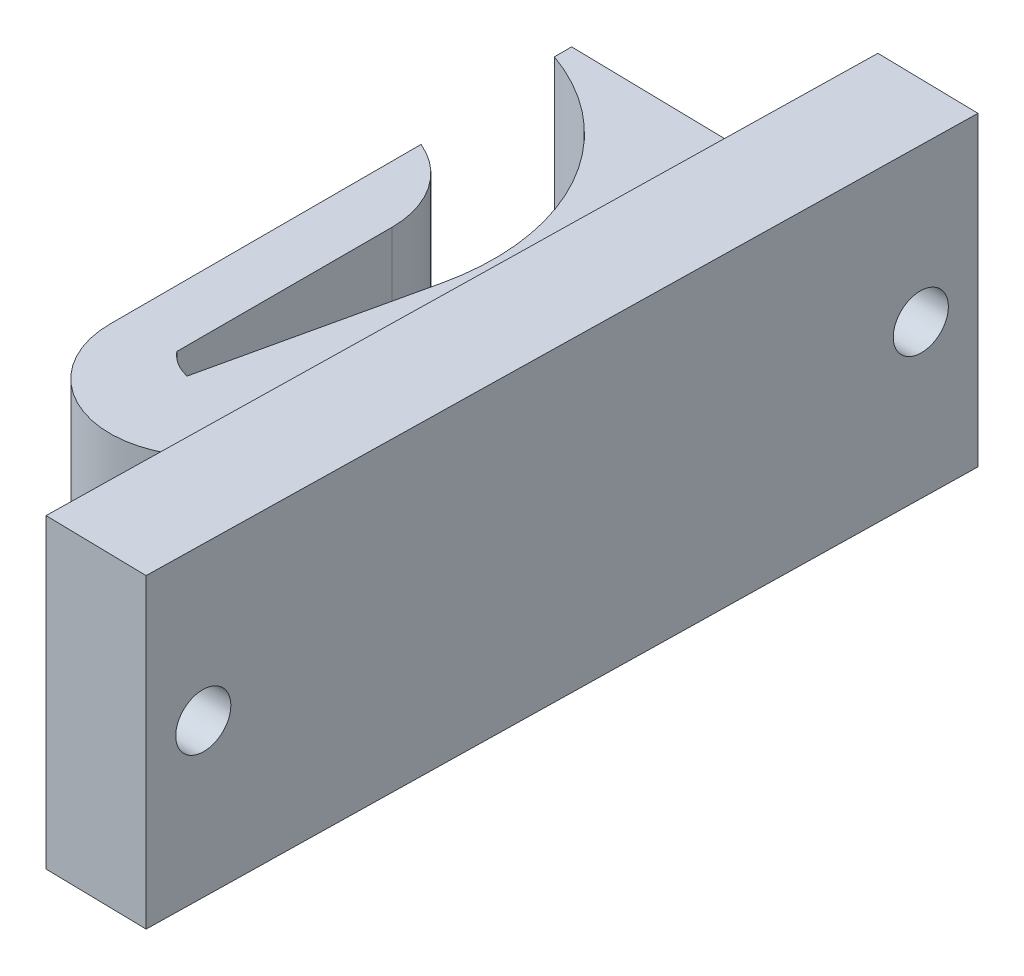
ISO-10303-21;
HEADER;
FILE_DESCRIPTION(('STEP AP214'),'2;1');
FILE_NAME('part.step','',(''),(''),'','','');
FILE_SCHEMA(('AUTOMOTIVE_DESIGN { 1 0 10303 214 1 1 1 1 }'));
ENDSEC;
DATA;
#1=APPLICATION_CONTEXT('core data for automotive mechanical design processes');
#2=APPLICATION_PROTOCOL_DEFINITION('international standard','automotive_design',2000,#1);
#3=PRODUCT_CONTEXT('',#1,'mechanical');
#4=PRODUCT('Part','Part','',(#3));
#5=PRODUCT_RELATED_PRODUCT_CATEGORY('part','',(#4));
#6=PRODUCT_DEFINITION_FORMATION('','',#4);
#7=PRODUCT_DEFINITION_CONTEXT('part definition',#1,'design');
#8=PRODUCT_DEFINITION('design','',#6,#7);
#9=PRODUCT_DEFINITION_SHAPE('','',#8);
#10=(LENGTH_UNIT() NAMED_UNIT(*) SI_UNIT(.MILLI.,.METRE.));
#11=(NAMED_UNIT(*) PLANE_ANGLE_UNIT() SI_UNIT($,.RADIAN.));
#12=(NAMED_UNIT(*) SI_UNIT($,.STERADIAN.) SOLID_ANGLE_UNIT());
#13=UNCERTAINTY_MEASURE_WITH_UNIT(LENGTH_MEASURE(1.E-05),#10,'distance_accuracy_value','');
#14=(GEOMETRIC_REPRESENTATION_CONTEXT(3) GLOBAL_UNCERTAINTY_ASSIGNED_CONTEXT((#13)) GLOBAL_UNIT_ASSIGNED_CONTEXT((#10,
#11,#12)) REPRESENTATION_CONTEXT('',''));
#15=CARTESIAN_POINT('',(0.,0.,0.));
#16=DIRECTION('',(0.,0.,1.));
#17=DIRECTION('',(1.,0.,0.));
#18=AXIS2_PLACEMENT_3D('',#15,#16,#17);
#19=CARTESIAN_POINT('',(19.4578777462422,25.,30.5814100525998));
#20=DIRECTION('',(0.,-1.,0.));
#21=DIRECTION('',(0.,0.,-1.));
#22=AXIS2_PLACEMENT_3D('',#19,#20,#21);
#23=CYLINDRICAL_SURFACE('',#22,4.71068136707812);
#24=CARTESIAN_POINT('',(19.4578777462422,0.,30.5814100525998));
#25=DIRECTION('',(0.,-1.,0.));
#26=DIRECTION('',(0.,0.,-1.));
#27=AXIS2_PLACEMENT_3D('',#24,#25,#26);
#28=CIRCLE('',#27,4.71068136707812);
#29=CARTESIAN_POINT('',(18.4245412724948,0.,35.177357688742));
#30=VERTEX_POINT('',#29);
#31=CARTESIAN_POINT('',(15.8330571777441,0.,33.589930417884));
#32=VERTEX_POINT('',#31);
#33=EDGE_CURVE('E152',#30,#32,#28,.T.);
#34=ORIENTED_EDGE('',*,*,#33,.T.);
#35=DIRECTION('',(0.,-1.,0.));
#36=VECTOR('',#35,1.);
#37=CARTESIAN_POINT('',(15.8330571777441,25.,33.589930417884));
#38=LINE('',#37,#36);
#39=CARTESIAN_POINT('',(15.8330571777441,25.,33.589930417884));
#40=VERTEX_POINT('',#39);
#41=EDGE_CURVE('E11',#40,#32,#38,.T.);
#42=ORIENTED_EDGE('',*,*,#41,.F.);
#43=CARTESIAN_POINT('',(19.4578777462422,25.,30.5814100525998));
#44=DIRECTION('',(0.,-1.,0.));
#45=DIRECTION('',(0.,0.,-1.));
#46=AXIS2_PLACEMENT_3D('',#43,#44,#45);
#47=CIRCLE('',#46,4.71068136707812);
#48=CARTESIAN_POINT('',(18.4245412724948,25.,35.177357688742));
#49=VERTEX_POINT('',#48);
#50=EDGE_CURVE('E183',#49,#40,#47,.T.);
#51=ORIENTED_EDGE('',*,*,#50,.F.);
#52=DIRECTION('',(0.,-1.,0.));
#53=VECTOR('',#52,1.);
#54=CARTESIAN_POINT('',(18.4245412724948,25.,35.177357688742));
#55=LINE('',#54,#53);
#56=EDGE_CURVE('E148',#49,#30,#55,.T.);
#57=ORIENTED_EDGE('',*,*,#56,.T.);
#58=EDGE_LOOP('',(#34,#42,#51,#57));
#59=FACE_BOUND('',#58,.T.);
#60=ADVANCED_FACE('F39',(#59),#23,.F.);
#61=CARTESIAN_POINT('',(15.8330571777441,25.,33.589930417884));
#62=DIRECTION('',(-1.,0.,0.));
#63=DIRECTION('',(0.,0.,1.));
#64=AXIS2_PLACEMENT_3D('',#61,#62,#63);
#65=PLANE('',#64);
#66=DIRECTION('',(0.,0.,-1.));
#67=VECTOR('',#66,1.);
#68=CARTESIAN_POINT('',(15.8330571777441,0.,33.589930417884));
#69=LINE('',#68,#67);
#70=CARTESIAN_POINT('',(15.8330571777441,0.,12.4880063048794));
#71=VERTEX_POINT('',#70);
#72=EDGE_CURVE('E156',#32,#71,#69,.T.);
#73=ORIENTED_EDGE('',*,*,#72,.T.);
#74=DIRECTION('',(0.,-1.,0.));
#75=VECTOR('',#74,1.);
#76=CARTESIAN_POINT('',(15.8330571777441,25.,12.4880063048794));
#77=LINE('',#76,#75);
#78=CARTESIAN_POINT('',(15.8330571777441,25.,12.4880063048794));
#79=VERTEX_POINT('',#78);
#80=EDGE_CURVE('E48',#79,#71,#77,.T.);
#81=ORIENTED_EDGE('',*,*,#80,.F.);
#82=DIRECTION('',(0.,0.,-1.));
#83=VECTOR('',#82,1.);
#84=CARTESIAN_POINT('',(15.8330571777441,25.,33.589930417884));
#85=LINE('',#84,#83);
#86=EDGE_CURVE('E103',#40,#79,#85,.T.);
#87=ORIENTED_EDGE('',*,*,#86,.F.);
#88=ORIENTED_EDGE('',*,*,#41,.T.);
#89=EDGE_LOOP('',(#73,#81,#87,#88));
#90=FACE_BOUND('',#89,.T.);
#91=ADVANCED_FACE('F330',(#90),#65,.F.);
#92=CARTESIAN_POINT('',(6.67701045397746,25.,12.4880063048794));
#93=DIRECTION('',(0.,-1.,0.));
#94=DIRECTION('',(0.,0.,-1.));
#95=AXIS2_PLACEMENT_3D('',#92,#93,#94);
#96=CYLINDRICAL_SURFACE('',#95,9.15604672376662);
#97=CARTESIAN_POINT('',(6.67701045397746,0.,12.4880063048794));
#98=DIRECTION('',(0.,1.,0.));
#99=DIRECTION('',(0.,0.,1.));
#100=AXIS2_PLACEMENT_3D('',#97,#98,#99);
#101=CIRCLE('',#100,9.15604672376662);
#102=CARTESIAN_POINT('',(10.2278698948714,0.,4.04854015832654));
#103=VERTEX_POINT('',#102);
#104=EDGE_CURVE('E160',#71,#103,#101,.T.);
#105=ORIENTED_EDGE('',*,*,#104,.T.);
#106=DIRECTION('',(0.,-1.,0.));
#107=VECTOR('',#106,1.);
#108=CARTESIAN_POINT('',(10.2278698948714,25.,4.04854015832654));
#109=LINE('',#108,#107);
#110=CARTESIAN_POINT('',(10.2278698948714,25.,4.04854015832654));
#111=VERTEX_POINT('',#110);
#112=EDGE_CURVE('E201',#111,#103,#109,.T.);
#113=ORIENTED_EDGE('',*,*,#112,.F.);
#114=CARTESIAN_POINT('',(6.67701045397746,25.,12.4880063048794));
#115=DIRECTION('',(0.,1.,0.));
#116=DIRECTION('',(0.,0.,1.));
#117=AXIS2_PLACEMENT_3D('',#114,#115,#116);
#118=CIRCLE('',#117,9.15604672376662);
#119=EDGE_CURVE('E211',#79,#111,#118,.T.);
#120=ORIENTED_EDGE('',*,*,#119,.F.);
#121=ORIENTED_EDGE('',*,*,#80,.T.);
#122=EDGE_LOOP('',(#105,#113,#120,#121));
#123=FACE_BOUND('',#122,.T.);
#124=ADVANCED_FACE('F209',(#123),#96,.T.);
#125=CARTESIAN_POINT('',(10.2278698948714,25.,4.04854015832654));
#126=DIRECTION('',(1.,0.,0.));
#127=DIRECTION('',(0.,0.,-1.));
#128=AXIS2_PLACEMENT_3D('',#125,#126,#127);
#129=PLANE('',#128);
#130=DIRECTION('',(0.,0.,1.));
#131=VECTOR('',#130,1.);
#132=CARTESIAN_POINT('',(10.2278698948714,0.,4.04854015832654));
#133=LINE('',#132,#131);
#134=CARTESIAN_POINT('',(10.2278698948714,0.,34.5268915551637));
#135=VERTEX_POINT('',#134);
#136=EDGE_CURVE('E163',#103,#135,#133,.T.);
#137=ORIENTED_EDGE('',*,*,#136,.T.);
#138=DIRECTION('',(0.,-1.,0.));
#139=VECTOR('',#138,1.);
#140=CARTESIAN_POINT('',(10.2278698948714,25.,34.5268915551637));
#141=LINE('',#140,#139);
#142=CARTESIAN_POINT('',(10.2278698948714,25.,34.5268915551637));
#143=VERTEX_POINT('',#142);
#144=EDGE_CURVE('E197',#143,#135,#141,.T.);
#145=ORIENTED_EDGE('',*,*,#144,.F.);
#146=DIRECTION('',(0.,0.,1.));
#147=VECTOR('',#146,1.);
#148=CARTESIAN_POINT('',(10.2278698948714,25.,4.04854015832654));
#149=LINE('',#148,#147);
#150=EDGE_CURVE('E230',#111,#143,#149,.T.);
#151=ORIENTED_EDGE('',*,*,#150,.F.);
#152=ORIENTED_EDGE('',*,*,#112,.T.);
#153=EDGE_LOOP('',(#137,#145,#151,#152));
#154=FACE_BOUND('',#153,.T.);
#155=ADVANCED_FACE('F220',(#154),#129,.F.);
#156=CARTESIAN_POINT('',(19.5243776115971,25.,34.5268915551637));
#157=DIRECTION('',(0.,-1.,0.));
#158=DIRECTION('',(0.,0.,-1.));
#159=AXIS2_PLACEMENT_3D('',#156,#157,#158);
#160=CYLINDRICAL_SURFACE('',#159,9.29650771672567);
#161=CARTESIAN_POINT('',(19.5243776115971,0.,34.5268915551637));
#162=DIRECTION('',(0.,1.,0.));
#163=DIRECTION('',(0.,0.,1.));
#164=AXIS2_PLACEMENT_3D('',#161,#162,#163);
#165=CIRCLE('',#164,9.29650771672567);
#166=CARTESIAN_POINT('',(25.9329867470875,0.,41.2614876585429));
#167=VERTEX_POINT('',#166);
#168=EDGE_CURVE('E166',#135,#167,#165,.T.);
#169=ORIENTED_EDGE('',*,*,#168,.T.);
#170=DIRECTION('',(0.,-1.,0.));
#171=VECTOR('',#170,1.);
#172=CARTESIAN_POINT('',(25.9329867470875,25.,41.2614876585429));
#173=LINE('',#172,#171);
#174=CARTESIAN_POINT('',(25.9329867470875,25.,41.2614876585429));
#175=VERTEX_POINT('',#174);
#176=EDGE_CURVE('E193',#175,#167,#173,.T.);
#177=ORIENTED_EDGE('',*,*,#176,.F.);
#178=CARTESIAN_POINT('',(19.5243776115971,25.,34.5268915551637));
#179=DIRECTION('',(0.,1.,0.));
#180=DIRECTION('',(0.,0.,1.));
#181=AXIS2_PLACEMENT_3D('',#178,#179,#180);
#182=CIRCLE('',#181,9.29650771672567);
#183=EDGE_CURVE('E226',#143,#175,#182,.T.);
#184=ORIENTED_EDGE('',*,*,#183,.F.);
#185=ORIENTED_EDGE('',*,*,#144,.T.);
#186=EDGE_LOOP('',(#169,#177,#184,#185));
#187=FACE_BOUND('',#186,.T.);
#188=ADVANCED_FACE('F224',(#187),#160,.T.);
#189=CARTESIAN_POINT('',(26.9375325014628,25.,-11.2670614667355));
#190=DIRECTION('',(-0.0191203094367821,0.,0.999817190173805));
#191=DIRECTION('',(0.999817190173805,0.,0.0191203094367821));
#192=AXIS2_PLACEMENT_3D('',#189,#190,#191);
#193=PLANE('',#192);
#194=DIRECTION('',(-0.999817190173805,0.,-0.0191203094367821));
#195=VECTOR('',#194,1.);
#196=CARTESIAN_POINT('',(26.9375325014628,0.,-11.2670614667355));
#197=LINE('',#196,#195);
#198=CARTESIAN_POINT('',(26.9375325014628,0.,-11.2670614667355));
#199=VERTEX_POINT('',#198);
#200=CARTESIAN_POINT('',(9.32651249786059,0.,-11.603851187172));
#201=VERTEX_POINT('',#200);
#202=EDGE_CURVE('E174',#199,#201,#197,.T.);
#203=ORIENTED_EDGE('',*,*,#202,.T.);
#204=DIRECTION('',(0.,-1.,0.));
#205=VECTOR('',#204,1.);
#206=CARTESIAN_POINT('',(9.32651249786059,25.,-11.603851187172));
#207=LINE('',#206,#205);
#208=CARTESIAN_POINT('',(9.32651249786059,25.,-11.603851187172));
#209=VERTEX_POINT('',#208);
#210=EDGE_CURVE('E141',#209,#201,#207,.T.);
#211=ORIENTED_EDGE('',*,*,#210,.F.);
#212=DIRECTION('',(-0.999817190173805,0.,-0.0191203094367821));
#213=VECTOR('',#212,1.);
#214=CARTESIAN_POINT('',(26.9375325014628,25.,-11.2670614667355));
#215=LINE('',#214,#213);
#216=CARTESIAN_POINT('',(26.9375325014628,25.,-11.2670614667355));
#217=VERTEX_POINT('',#216);
#218=EDGE_CURVE('E130',#217,#209,#215,.T.);
#219=ORIENTED_EDGE('',*,*,#218,.F.);
#220=DIRECTION('',(0.,-1.,0.));
#221=VECTOR('',#220,1.);
#222=CARTESIAN_POINT('',(26.9375325014628,25.,-11.2670614667355));
#223=LINE('',#222,#221);
#224=EDGE_CURVE('E190',#217,#199,#223,.T.);
#225=ORIENTED_EDGE('',*,*,#224,.T.);
#226=EDGE_LOOP('',(#203,#211,#219,#225));
#227=FACE_BOUND('',#226,.T.);
#228=ADVANCED_FACE('F407',(#227),#193,.F.);
#229=CARTESIAN_POINT('',(9.32651249786059,25.,-11.603851187172));
#230=DIRECTION('',(1.,0.,0.));
#231=DIRECTION('',(0.,0.,-1.));
#232=AXIS2_PLACEMENT_3D('',#229,#230,#231);
#233=PLANE('',#232);
#234=DIRECTION('',(0.,0.,1.));
#235=VECTOR('',#234,1.);
#236=CARTESIAN_POINT('',(9.32651249786059,0.,-11.603851187172));
#237=LINE('',#236,#235);
#238=CARTESIAN_POINT('',(9.32651249786059,0.,-9.914096331229));
#239=VERTEX_POINT('',#238);
#240=EDGE_CURVE('E139',#201,#239,#237,.T.);
#241=ORIENTED_EDGE('',*,*,#240,.T.);
#242=DIRECTION('',(0.,-1.,0.));
#243=VECTOR('',#242,1.);
#244=CARTESIAN_POINT('',(9.32651249786059,25.,-9.914096331229));
#245=LINE('',#244,#243);
#246=CARTESIAN_POINT('',(9.32651249786059,25.,-9.914096331229));
#247=VERTEX_POINT('',#246);
#248=EDGE_CURVE('E136',#247,#239,#245,.T.);
#249=ORIENTED_EDGE('',*,*,#248,.F.);
#250=DIRECTION('',(0.,0.,1.));
#251=VECTOR('',#250,1.);
#252=CARTESIAN_POINT('',(9.32651249786059,25.,-11.603851187172));
#253=LINE('',#252,#251);
#254=EDGE_CURVE('E124',#209,#247,#253,.T.);
#255=ORIENTED_EDGE('',*,*,#254,.F.);
#256=ORIENTED_EDGE('',*,*,#210,.T.);
#257=EDGE_LOOP('',(#241,#249,#255,#256));
#258=FACE_BOUND('',#257,.T.);
#259=ADVANCED_FACE('F137',(#258),#233,.F.);
#260=CARTESIAN_POINT('',(2.26541768259489,25.,10.1372936714378));
#261=DIRECTION('',(0.,-1.,0.));
#262=DIRECTION('',(0.,0.,-1.));
#263=AXIS2_PLACEMENT_3D('',#260,#261,#262);
#264=CYLINDRICAL_SURFACE('',#263,21.2583466203093);
#265=CARTESIAN_POINT('',(2.26541768259489,0.,10.1372936714378));
#266=DIRECTION('',(0.,-1.,0.));
#267=DIRECTION('',(0.,0.,1.));
#268=AXIS2_PLACEMENT_3D('',#265,#266,#267);
#269=CIRCLE('',#268,21.2583466203093);
#270=CARTESIAN_POINT('',(23.0059943177965,0.,14.8005309448931));
#271=VERTEX_POINT('',#270);
#272=EDGE_CURVE('E89',#239,#271,#269,.T.);
#273=ORIENTED_EDGE('',*,*,#272,.T.);
#274=DIRECTION('',(0.,-1.,0.));
#275=VECTOR('',#274,1.);
#276=CARTESIAN_POINT('',(23.0059943177965,25.,14.8005309448931));
#277=LINE('',#276,#275);
#278=CARTESIAN_POINT('',(23.0059943177965,25.,14.8005309448931));
#279=VERTEX_POINT('',#278);
#280=EDGE_CURVE('E142',#279,#271,#277,.T.);
#281=ORIENTED_EDGE('',*,*,#280,.F.);
#282=CARTESIAN_POINT('',(2.26541768259489,25.,10.1372936714378));
#283=DIRECTION('',(0.,-1.,0.));
#284=DIRECTION('',(0.,0.,1.));
#285=AXIS2_PLACEMENT_3D('',#282,#283,#284);
#286=CIRCLE('',#285,21.2583466203093);
#287=EDGE_CURVE('E128',#247,#279,#286,.T.);
#288=ORIENTED_EDGE('',*,*,#287,.F.);
#289=ORIENTED_EDGE('',*,*,#248,.T.);
#290=EDGE_LOOP('',(#273,#281,#288,#289));
#291=FACE_BOUND('',#290,.T.);
#292=ADVANCED_FACE('F144',(#291),#264,.F.);
#293=CARTESIAN_POINT('',(18.4245412724948,25.,35.177357688742));
#294=DIRECTION('',(0.975643920274919,0.,0.219360299121303));
#295=DIRECTION('',(0.219360299121303,0.,-0.975643920274919));
#296=AXIS2_PLACEMENT_3D('',#293,#294,#295);
#297=PLANE('',#296);
#298=DIRECTION('',(-0.219360299121303,0.,0.975643920274919));
#299=VECTOR('',#298,1.);
#300=CARTESIAN_POINT('',(18.4245412724948,0.,35.177357688742));
#301=LINE('',#300,#299);
#302=EDGE_CURVE('E95',#271,#30,#301,.T.);
#303=ORIENTED_EDGE('',*,*,#302,.T.);
#304=ORIENTED_EDGE('',*,*,#56,.F.);
#305=DIRECTION('',(-0.219360299121303,0.,0.975643920274919));
#306=VECTOR('',#305,1.);
#307=CARTESIAN_POINT('',(18.4245412724948,25.,35.177357688742));
#308=LINE('',#307,#306);
#309=EDGE_CURVE('E56',#279,#49,#308,.T.);
#310=ORIENTED_EDGE('',*,*,#309,.F.);
#311=ORIENTED_EDGE('',*,*,#280,.T.);
#312=EDGE_LOOP('',(#303,#304,#310,#311));
#313=FACE_BOUND('',#312,.T.);
#314=ADVANCED_FACE('F398',(#313),#297,.F.);
#315=CARTESIAN_POINT('',(19.4578777462422,25.,30.5814100525998));
#316=DIRECTION('',(0.,-1.,0.));
#317=DIRECTION('',(0.,0.,-1.));
#318=AXIS2_PLACEMENT_3D('',#315,#316,#317);
#319=PLANE('',#318);
#320=ORIENTED_EDGE('',*,*,#50,.T.);
#321=ORIENTED_EDGE('',*,*,#86,.T.);
#322=ORIENTED_EDGE('',*,*,#119,.T.);
#323=ORIENTED_EDGE('',*,*,#150,.T.);
#324=ORIENTED_EDGE('',*,*,#183,.T.);
#325=DIRECTION('',(0.0191203094367821,0.,-0.999817190173805));
#326=VECTOR('',#325,1.);
#327=CARTESIAN_POINT('',(25.9329867470875,25.,41.2614876585429));
#328=LINE('',#327,#326);
#329=EDGE_CURVE('E229',#175,#217,#328,.T.);
#330=ORIENTED_EDGE('',*,*,#329,.T.);
#331=ORIENTED_EDGE('',*,*,#218,.T.);
#332=ORIENTED_EDGE('',*,*,#254,.T.);
#333=ORIENTED_EDGE('',*,*,#287,.T.);
#334=ORIENTED_EDGE('',*,*,#309,.T.);
#335=EDGE_LOOP('',(#320,#321,#322,#323,#324,#330,#331,#332,#333,#334));
#336=FACE_BOUND('',#335,.T.);
#337=ADVANCED_FACE('F126',(#336),#319,.F.);
#338=CARTESIAN_POINT('',(19.4578777462422,0.,30.5814100525998));
#339=DIRECTION('',(0.,-1.,0.));
#340=DIRECTION('',(0.,0.,-1.));
#341=AXIS2_PLACEMENT_3D('',#338,#339,#340);
#342=PLANE('',#341);
#343=ORIENTED_EDGE('',*,*,#33,.F.);
#344=ORIENTED_EDGE('',*,*,#302,.F.);
#345=ORIENTED_EDGE('',*,*,#272,.F.);
#346=ORIENTED_EDGE('',*,*,#240,.F.);
#347=ORIENTED_EDGE('',*,*,#202,.F.);
#348=DIRECTION('',(0.0191203094367821,0.,-0.999817190173805));
#349=VECTOR('',#348,1.);
#350=CARTESIAN_POINT('',(25.9329867470875,0.,41.2614876585429));
#351=LINE('',#350,#349);
#352=EDGE_CURVE('E170',#167,#199,#351,.T.);
#353=ORIENTED_EDGE('',*,*,#352,.F.);
#354=ORIENTED_EDGE('',*,*,#168,.F.);
#355=ORIENTED_EDGE('',*,*,#136,.F.);
#356=ORIENTED_EDGE('',*,*,#104,.F.);
#357=ORIENTED_EDGE('',*,*,#72,.F.);
#358=EDGE_LOOP('',(#343,#344,#345,#346,#347,#353,#354,#355,#356,#357));
#359=FACE_BOUND('',#358,.T.);
#360=ADVANCED_FACE('F215',(#359),#342,.T.);
#361=CARTESIAN_POINT('',(26.7122941914095,0.,0.510840717408869));
#362=DIRECTION('',(0.999817190173805,0.,0.0191203094367821));
#363=DIRECTION('',(0.0191203094367821,0.,-0.999817190173805));
#364=AXIS2_PLACEMENT_3D('',#361,#362,#363);
#365=PLANE('',#364);
#366=DIRECTION('',(0.,1.,0.));
#367=VECTOR('',#366,1.);
#368=CARTESIAN_POINT('',(27.1765363694225,27.3,-23.764776343908));
#369=LINE('',#368,#367);
#370=CARTESIAN_POINT('',(27.1765363694225,-2.7,-23.764776343908));
#371=VERTEX_POINT('',#370);
#372=CARTESIAN_POINT('',(27.1765363694225,27.3,-23.764776343908));
#373=VERTEX_POINT('',#372);
#374=EDGE_CURVE('E273',#371,#373,#369,.T.);
#375=ORIENTED_EDGE('',*,*,#374,.F.);
#376=DIRECTION('',(0.0191203094367821,0.,-0.999817190173805));
#377=VECTOR('',#376,1.);
#378=CARTESIAN_POINT('',(25.64691161448,-2.7,56.2205988699963));
#379=LINE('',#378,#377);
#380=CARTESIAN_POINT('',(25.64691161448,-2.7,56.2205988699963));
#381=VERTEX_POINT('',#380);
#382=EDGE_CURVE('E260',#381,#371,#379,.T.);
#383=ORIENTED_EDGE('',*,*,#382,.F.);
#384=DIRECTION('',(0.,-1.,0.));
#385=VECTOR('',#384,1.);
#386=CARTESIAN_POINT('',(25.64691161448,27.3,56.2205988699963));
#387=LINE('',#386,#385);
#388=CARTESIAN_POINT('',(25.64691161448,27.3,56.2205988699963));
#389=VERTEX_POINT('',#388);
#390=EDGE_CURVE('E265',#389,#381,#387,.T.);
#391=ORIENTED_EDGE('',*,*,#390,.F.);
#392=DIRECTION('',(-0.0191203094367821,0.,0.999817190173805));
#393=VECTOR('',#392,1.);
#394=CARTESIAN_POINT('',(25.64691161448,27.3,56.2205988699963));
#395=LINE('',#394,#393);
#396=EDGE_CURVE('E269',#373,#389,#395,.T.);
#397=ORIENTED_EDGE('',*,*,#396,.F.);
#398=EDGE_LOOP('',(#375,#383,#391,#397));
#399=FACE_BOUND('',#398,.T.);
#400=CARTESIAN_POINT('',(27.0713746675202,12.3,-18.2657817979521));
#401=DIRECTION('',(0.999817190173805,0.,0.0191203094367821));
#402=DIRECTION('',(0.0191203094367821,0.,-0.999817190173805));
#403=AXIS2_PLACEMENT_3D('',#400,#401,#402);
#404=CIRCLE('',#403,2.6510569966331);
#405=CARTESIAN_POINT('',(27.1220636976304,12.3,-20.9163541553164));
#406=VERTEX_POINT('',#405);
#407=EDGE_CURVE('E292',#406,#406,#404,.T.);
#408=ORIENTED_EDGE('',*,*,#407,.T.);
#409=EDGE_LOOP('',(#408));
#410=FACE_BOUND('',#409,.T.);
#411=CARTESIAN_POINT('',(25.7520733163823,12.3,50.7216043240404));
#412=DIRECTION('',(0.999817190173805,0.,0.0191203094367821));
#413=DIRECTION('',(0.0191203094367821,0.,-0.999817190173805));
#414=AXIS2_PLACEMENT_3D('',#411,#412,#413);
#415=CIRCLE('',#414,2.6510569966331);
#416=CARTESIAN_POINT('',(25.8027623464924,12.3,48.0710319666761));
#417=VERTEX_POINT('',#416);
#418=EDGE_CURVE('E300',#417,#417,#415,.T.);
#419=ORIENTED_EDGE('',*,*,#418,.T.);
#420=EDGE_LOOP('',(#419));
#421=FACE_BOUND('',#420,.T.);
#422=ORIENTED_EDGE('',*,*,#176,.T.);
#423=ORIENTED_EDGE('',*,*,#352,.T.);
#424=ORIENTED_EDGE('',*,*,#224,.F.);
#425=ORIENTED_EDGE('',*,*,#329,.F.);
#426=EDGE_LOOP('',(#422,#423,#424,#425));
#427=FACE_BOUND('',#426,.T.);
#428=ADVANCED_FACE('F314',(#399,#410,#421,#427),#365,.F.);
#429=CARTESIAN_POINT('',(36.7104660931475,0.,0.70204381177669));
#430=DIRECTION('',(0.999817190173805,0.,0.0191203094367821));
#431=DIRECTION('',(0.0191203094367821,0.,-0.999817190173805));
#432=AXIS2_PLACEMENT_3D('',#429,#430,#431);
#433=PLANE('',#432);
#434=CARTESIAN_POINT('',(37.0695465692583,12.3,-18.0745787035843));
#435=DIRECTION('',(0.999817190173805,0.,0.0191203094367821));
#436=DIRECTION('',(0.0191203094367821,0.,-0.999817190173805));
#437=AXIS2_PLACEMENT_3D('',#434,#435,#436);
#438=CIRCLE('',#437,2.6510569966331);
#439=CARTESIAN_POINT('',(37.1202355993684,12.3,-20.7251510609486));
#440=VERTEX_POINT('',#439);
#441=EDGE_CURVE('E277',#440,#440,#438,.T.);
#442=ORIENTED_EDGE('',*,*,#441,.F.);
#443=EDGE_LOOP('',(#442));
#444=FACE_BOUND('',#443,.T.);
#445=DIRECTION('',(0.,1.,0.));
#446=VECTOR('',#445,1.);
#447=CARTESIAN_POINT('',(37.1747082711606,27.3,-23.5735732495402));
#448=LINE('',#447,#446);
#449=CARTESIAN_POINT('',(37.1747082711606,-2.7,-23.5735732495402));
#450=VERTEX_POINT('',#449);
#451=CARTESIAN_POINT('',(37.1747082711606,27.3,-23.5735732495402));
#452=VERTEX_POINT('',#451);
#453=EDGE_CURVE('E264',#450,#452,#448,.T.);
#454=ORIENTED_EDGE('',*,*,#453,.T.);
#455=DIRECTION('',(-0.0191203094367821,0.,0.999817190173805));
#456=VECTOR('',#455,1.);
#457=CARTESIAN_POINT('',(35.645083516218,27.3,56.4118019643642));
#458=LINE('',#457,#456);
#459=CARTESIAN_POINT('',(35.645083516218,27.3,56.4118019643642));
#460=VERTEX_POINT('',#459);
#461=EDGE_CURVE('E285',#452,#460,#458,.T.);
#462=ORIENTED_EDGE('',*,*,#461,.T.);
#463=DIRECTION('',(0.,-1.,0.));
#464=VECTOR('',#463,1.);
#465=CARTESIAN_POINT('',(35.645083516218,27.3,56.4118019643642));
#466=LINE('',#465,#464);
#467=CARTESIAN_POINT('',(35.645083516218,-2.7,56.4118019643642));
#468=VERTEX_POINT('',#467);
#469=EDGE_CURVE('E281',#460,#468,#466,.T.);
#470=ORIENTED_EDGE('',*,*,#469,.T.);
#471=DIRECTION('',(0.0191203094367821,0.,-0.999817190173805));
#472=VECTOR('',#471,1.);
#473=CARTESIAN_POINT('',(35.645083516218,-2.7,56.4118019643642));
#474=LINE('',#473,#472);
#475=EDGE_CURVE('E259',#468,#450,#474,.T.);
#476=ORIENTED_EDGE('',*,*,#475,.T.);
#477=EDGE_LOOP('',(#454,#462,#470,#476));
#478=FACE_BOUND('',#477,.T.);
#479=CARTESIAN_POINT('',(35.7502452181203,12.3,50.9128074184082));
#480=DIRECTION('',(0.999817190173805,0.,0.0191203094367821));
#481=DIRECTION('',(0.0191203094367821,0.,-0.999817190173805));
#482=AXIS2_PLACEMENT_3D('',#479,#480,#481);
#483=CIRCLE('',#482,2.6510569966331);
#484=CARTESIAN_POINT('',(35.8009342482305,12.3,48.2622350610439));
#485=VERTEX_POINT('',#484);
#486=EDGE_CURVE('E296',#485,#485,#483,.T.);
#487=ORIENTED_EDGE('',*,*,#486,.F.);
#488=EDGE_LOOP('',(#487));
#489=FACE_BOUND('',#488,.T.);
#490=ADVANCED_FACE('F311',(#444,#478,#489),#433,.T.);
#491=CARTESIAN_POINT('',(37.1747082711606,27.3,-23.5735732495402));
#492=DIRECTION('',(-0.0191203094367821,0.,0.999817190173805));
#493=DIRECTION('',(0.999817190173805,0.,0.0191203094367821));
#494=AXIS2_PLACEMENT_3D('',#491,#492,#493);
#495=PLANE('',#494);
#496=ORIENTED_EDGE('',*,*,#374,.T.);
#497=DIRECTION('',(-0.999817190173805,0.,-0.0191203094367821));
#498=VECTOR('',#497,1.);
#499=CARTESIAN_POINT('',(37.1747082711606,27.3,-23.5735732495402));
#500=LINE('',#499,#498);
#501=EDGE_CURVE('E157',#452,#373,#500,.T.);
#502=ORIENTED_EDGE('',*,*,#501,.F.);
#503=ORIENTED_EDGE('',*,*,#453,.F.);
#504=DIRECTION('',(-0.999817190173805,0.,-0.0191203094367821));
#505=VECTOR('',#504,1.);
#506=CARTESIAN_POINT('',(37.1747082711606,-2.7,-23.5735732495402));
#507=LINE('',#506,#505);
#508=EDGE_CURVE('E255',#450,#371,#507,.T.);
#509=ORIENTED_EDGE('',*,*,#508,.T.);
#510=EDGE_LOOP('',(#496,#502,#503,#509));
#511=FACE_BOUND('',#510,.T.);
#512=ADVANCED_FACE('F313',(#511),#495,.F.);
#513=CARTESIAN_POINT('',(35.645083516218,27.3,56.4118019643642));
#514=DIRECTION('',(0.,-1.,0.));
#515=DIRECTION('',(0.,0.,-1.));
#516=AXIS2_PLACEMENT_3D('',#513,#514,#515);
#517=PLANE('',#516);
#518=ORIENTED_EDGE('',*,*,#396,.T.);
#519=DIRECTION('',(-0.999817190173805,0.,-0.0191203094367821));
#520=VECTOR('',#519,1.);
#521=CARTESIAN_POINT('',(35.645083516218,27.3,56.4118019643642));
#522=LINE('',#521,#520);
#523=EDGE_CURVE('E247',#460,#389,#522,.T.);
#524=ORIENTED_EDGE('',*,*,#523,.F.);
#525=ORIENTED_EDGE('',*,*,#461,.F.);
#526=ORIENTED_EDGE('',*,*,#501,.T.);
#527=EDGE_LOOP('',(#518,#524,#525,#526));
#528=FACE_BOUND('',#527,.T.);
#529=ADVANCED_FACE('F321',(#528),#517,.F.);
#530=CARTESIAN_POINT('',(35.645083516218,27.3,56.4118019643642));
#531=DIRECTION('',(0.0191203094367821,0.,-0.999817190173805));
#532=DIRECTION('',(-0.999817190173805,0.,-0.0191203094367821));
#533=AXIS2_PLACEMENT_3D('',#530,#531,#532);
#534=PLANE('',#533);
#535=ORIENTED_EDGE('',*,*,#390,.T.);
#536=DIRECTION('',(-0.999817190173805,0.,-0.0191203094367821));
#537=VECTOR('',#536,1.);
#538=CARTESIAN_POINT('',(35.645083516218,-2.7,56.4118019643642));
#539=LINE('',#538,#537);
#540=EDGE_CURVE('E251',#468,#381,#539,.T.);
#541=ORIENTED_EDGE('',*,*,#540,.F.);
#542=ORIENTED_EDGE('',*,*,#469,.F.);
#543=ORIENTED_EDGE('',*,*,#523,.T.);
#544=EDGE_LOOP('',(#535,#541,#542,#543));
#545=FACE_BOUND('',#544,.T.);
#546=ADVANCED_FACE('F370',(#545),#534,.F.);
#547=CARTESIAN_POINT('',(35.645083516218,-2.7,56.4118019643642));
#548=DIRECTION('',(0.,1.,0.));
#549=DIRECTION('',(0.,0.,1.));
#550=AXIS2_PLACEMENT_3D('',#547,#548,#549);
#551=PLANE('',#550);
#552=ORIENTED_EDGE('',*,*,#382,.T.);
#553=ORIENTED_EDGE('',*,*,#508,.F.);
#554=ORIENTED_EDGE('',*,*,#475,.F.);
#555=ORIENTED_EDGE('',*,*,#540,.T.);
#556=EDGE_LOOP('',(#552,#553,#554,#555));
#557=FACE_BOUND('',#556,.T.);
#558=ADVANCED_FACE('F371',(#557),#551,.F.);
#559=CARTESIAN_POINT('',(37.0695465692583,12.3,-18.0745787035843));
#560=DIRECTION('',(-0.999817190173805,0.,-0.0191203094367821));
#561=DIRECTION('',(-0.0191203094367821,0.,0.999817190173805));
#562=AXIS2_PLACEMENT_3D('',#559,#560,#561);
#563=CYLINDRICAL_SURFACE('',#562,2.6510569966331);
#564=ORIENTED_EDGE('',*,*,#441,.T.);
#565=EDGE_LOOP('',(#564));
#566=FACE_BOUND('',#565,.T.);
#567=ORIENTED_EDGE('',*,*,#407,.F.);
#568=EDGE_LOOP('',(#567));
#569=FACE_BOUND('',#568,.T.);
#570=ADVANCED_FACE('F378',(#566,#569),#563,.F.);
#571=CARTESIAN_POINT('',(35.7502452181203,12.3,50.9128074184082));
#572=DIRECTION('',(-0.999817190173805,0.,-0.0191203094367821));
#573=DIRECTION('',(-0.0191203094367821,0.,0.999817190173805));
#574=AXIS2_PLACEMENT_3D('',#571,#572,#573);
#575=CYLINDRICAL_SURFACE('',#574,2.6510569966331);
#576=ORIENTED_EDGE('',*,*,#486,.T.);
#577=EDGE_LOOP('',(#576));
#578=FACE_BOUND('',#577,.T.);
#579=ORIENTED_EDGE('',*,*,#418,.F.);
#580=EDGE_LOOP('',(#579));
#581=FACE_BOUND('',#580,.T.);
#582=ADVANCED_FACE('F308',(#578,#581),#575,.F.);
#583=CLOSED_SHELL('',(#60,#91,#124,#155,#188,#228,#259,#292,#314,#337,#360,#428,#490,#512,#529,
#546,#558,#570,#582));
#584=MANIFOLD_SOLID_BREP('B2',#583);
#585=ADVANCED_BREP_SHAPE_REPRESENTATION('',(#18,#584),#14);
#586=SHAPE_DEFINITION_REPRESENTATION(#9,#585);
ENDSEC;
END-ISO-10303-21;
